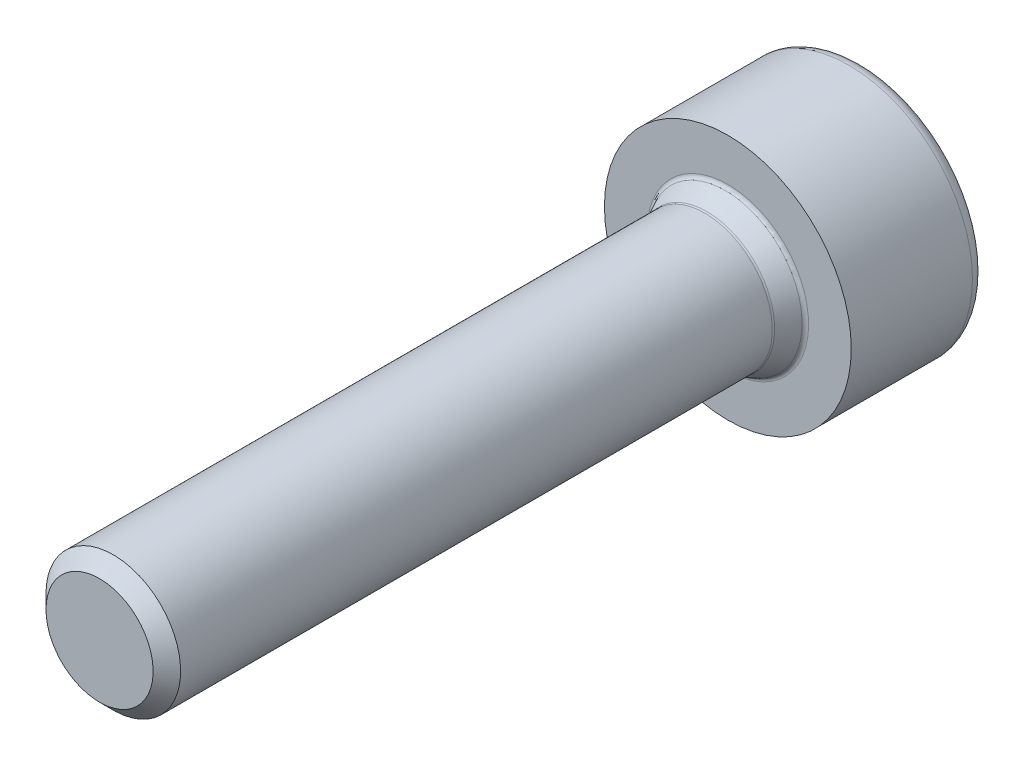
ISO-10303-21;
HEADER;
FILE_DESCRIPTION(('STEP AP214'),'2;1');
FILE_NAME('part.step','',(''),(''),'','','');
FILE_SCHEMA(('AUTOMOTIVE_DESIGN { 1 0 10303 214 1 1 1 1 }'));
ENDSEC;
DATA;
#1=APPLICATION_CONTEXT('core data for automotive mechanical design processes');
#2=APPLICATION_PROTOCOL_DEFINITION('international standard','automotive_design',2000,#1);
#3=PRODUCT_CONTEXT('',#1,'mechanical');
#4=PRODUCT('Part','Part','',(#3));
#5=PRODUCT_RELATED_PRODUCT_CATEGORY('part','',(#4));
#6=PRODUCT_DEFINITION_FORMATION('','',#4);
#7=PRODUCT_DEFINITION_CONTEXT('part definition',#1,'design');
#8=PRODUCT_DEFINITION('design','',#6,#7);
#9=PRODUCT_DEFINITION_SHAPE('','',#8);
#10=(LENGTH_UNIT() NAMED_UNIT(*) SI_UNIT(.MILLI.,.METRE.));
#11=(NAMED_UNIT(*) PLANE_ANGLE_UNIT() SI_UNIT($,.RADIAN.));
#12=(NAMED_UNIT(*) SI_UNIT($,.STERADIAN.) SOLID_ANGLE_UNIT());
#13=UNCERTAINTY_MEASURE_WITH_UNIT(LENGTH_MEASURE(1.E-05),#10,'distance_accuracy_value','');
#14=(GEOMETRIC_REPRESENTATION_CONTEXT(3) GLOBAL_UNCERTAINTY_ASSIGNED_CONTEXT((#13)) GLOBAL_UNIT_ASSIGNED_CONTEXT((#10,
#11,#12)) REPRESENTATION_CONTEXT('',''));
#15=CARTESIAN_POINT('',(0.,0.,0.));
#16=DIRECTION('',(0.,0.,1.));
#17=DIRECTION('',(1.,0.,0.));
#18=AXIS2_PLACEMENT_3D('',#15,#16,#17);
#19=CARTESIAN_POINT('',(-145.250000000003,415.751632486842,-409.507743681072));
#20=DIRECTION('',(0.,0.,1.));
#21=DIRECTION('',(1.,0.,0.));
#22=AXIS2_PLACEMENT_3D('',#19,#20,#21);
#23=PLANE('',#22);
#24=DIRECTION('',(-0.866025403784438,0.500000000000001,0.));
#25=VECTOR('',#24,1.);
#26=CARTESIAN_POINT('',(-144.000000000003,416.473320323329,-409.507743681072));
#27=LINE('',#26,#25);
#28=CARTESIAN_POINT('',(-144.625000000108,416.83416424139,-409.507743681423));
#29=VERTEX_POINT('',#28);
#30=CARTESIAN_POINT('',(-144.000000000003,416.473320323329,-409.507743681072));
#31=VERTEX_POINT('',#30);
#32=EDGE_CURVE('E162',#29,#31,#27,.F.);
#33=ORIENTED_EDGE('',*,*,#32,.T.);
#34=DIRECTION('',(0.,1.,0.));
#35=VECTOR('',#34,1.);
#36=CARTESIAN_POINT('',(-144.000000000003,415.029944650355,-409.507743681072));
#37=LINE('',#36,#35);
#38=CARTESIAN_POINT('',(-144.000000000213,415.751632486842,-409.507743681423));
#39=VERTEX_POINT('',#38);
#40=EDGE_CURVE('E158',#31,#39,#37,.F.);
#41=ORIENTED_EDGE('',*,*,#40,.T.);
#42=CARTESIAN_POINT('',(-145.250000000003,415.751632486842,-409.507743681774));
#43=DIRECTION('',(1.84168872111663E-13,0.,-1.));
#44=DIRECTION('',(-1.,0.,-1.84168872111663E-13));
#45=AXIS2_PLACEMENT_3D('',#42,#43,#44);
#46=CIRCLE('',#45,1.24999999957945);
#47=EDGE_CURVE('E159',#39,#29,#46,.F.);
#48=ORIENTED_EDGE('',*,*,#47,.T.);
#49=EDGE_LOOP('',(#33,#41,#48));
#50=FACE_BOUND('',#49,.T.);
#51=ADVANCED_FACE('F17',(#50),#23,.F.);
#52=CARTESIAN_POINT('',(-145.250000000003,415.751632486842,-409.507743681072));
#53=DIRECTION('',(0.,0.,1.));
#54=DIRECTION('',(1.,0.,0.));
#55=AXIS2_PLACEMENT_3D('',#52,#53,#54);
#56=PLANE('',#55);
#57=DIRECTION('',(-0.866025403784439,-0.499999999999999,0.));
#58=VECTOR('',#57,1.);
#59=CARTESIAN_POINT('',(-145.250000000003,417.195008159816,-409.507743681072));
#60=LINE('',#59,#58);
#61=CARTESIAN_POINT('',(-145.874999999898,416.83416424139,-409.507743681423));
#62=VERTEX_POINT('',#61);
#63=CARTESIAN_POINT('',(-145.250000000003,417.195008159816,-409.507743681072));
#64=VERTEX_POINT('',#63);
#65=EDGE_CURVE('E526',#62,#64,#60,.F.);
#66=ORIENTED_EDGE('',*,*,#65,.T.);
#67=DIRECTION('',(-0.866025403784438,0.500000000000001,0.));
#68=VECTOR('',#67,1.);
#69=CARTESIAN_POINT('',(-144.000000000003,416.473320323329,-409.507743681072));
#70=LINE('',#69,#68);
#71=EDGE_CURVE('E554',#64,#29,#70,.F.);
#72=ORIENTED_EDGE('',*,*,#71,.T.);
#73=CARTESIAN_POINT('',(-145.250000000003,415.751632486842,-409.507743681774));
#74=DIRECTION('',(1.84168872111663E-13,0.,-1.));
#75=DIRECTION('',(-1.,0.,-1.84168872111663E-13));
#76=AXIS2_PLACEMENT_3D('',#73,#74,#75);
#77=CIRCLE('',#76,1.24999999957946);
#78=EDGE_CURVE('E177',#62,#29,#77,.T.);
#79=ORIENTED_EDGE('',*,*,#78,.F.);
#80=EDGE_LOOP('',(#66,#72,#79));
#81=FACE_BOUND('',#80,.T.);
#82=ADVANCED_FACE('F752',(#81),#56,.F.);
#83=CARTESIAN_POINT('',(-144.000000000003,416.473320323329,-409.507743681072));
#84=DIRECTION('',(0.500000000000001,0.866025403784438,0.));
#85=DIRECTION('',(-0.866025403784438,0.500000000000001,0.));
#86=AXIS2_PLACEMENT_3D('',#83,#84,#85);
#87=PLANE('',#86);
#88=DIRECTION('',(-0.866025403784438,0.500000000000001,0.));
#89=VECTOR('',#88,1.);
#90=CARTESIAN_POINT('',(-144.000000000003,416.473320323329,-411.357743681072));
#91=LINE('',#90,#89);
#92=CARTESIAN_POINT('',(-144.000000000003,416.473320323329,-411.357743681072));
#93=VERTEX_POINT('',#92);
#94=CARTESIAN_POINT('',(-144.014636379167,416.48177064078,-411.357743681111));
#95=VERTEX_POINT('',#94);
#96=EDGE_CURVE('E426',#93,#95,#91,.T.);
#97=ORIENTED_EDGE('',*,*,#96,.F.);
#98=DIRECTION('',(0.,0.,-1.));
#99=VECTOR('',#98,1.);
#100=CARTESIAN_POINT('',(-144.000000000003,416.473320323329,-409.507743681072));
#101=LINE('',#100,#99);
#102=EDGE_CURVE('E167',#93,#31,#101,.F.);
#103=ORIENTED_EDGE('',*,*,#102,.T.);
#104=ORIENTED_EDGE('',*,*,#32,.F.);
#105=ORIENTED_EDGE('',*,*,#71,.F.);
#106=DIRECTION('',(0.,0.,1.));
#107=VECTOR('',#106,1.);
#108=CARTESIAN_POINT('',(-145.250000000003,417.195008159816,-409.507743681072));
#109=LINE('',#108,#107);
#110=CARTESIAN_POINT('',(-145.250000000003,417.195008159816,-411.357743681072));
#111=VERTEX_POINT('',#110);
#112=EDGE_CURVE('E516',#64,#111,#109,.F.);
#113=ORIENTED_EDGE('',*,*,#112,.T.);
#114=DIRECTION('',(-0.866025403784438,0.500000000000001,0.));
#115=VECTOR('',#114,1.);
#116=CARTESIAN_POINT('',(-144.000000000003,416.473320323329,-411.357743681072));
#117=LINE('',#116,#115);
#118=CARTESIAN_POINT('',(-145.235363620984,417.186557842449,-411.357743681194));
#119=VERTEX_POINT('',#118);
#120=EDGE_CURVE('E180',#119,#111,#117,.T.);
#121=ORIENTED_EDGE('',*,*,#120,.F.);
#122=CARTESIAN_POINT('',(-144.014636378931,416.48177064067,-411.357743681226));
#123=CARTESIAN_POINT('',(-144.056485828102,416.505932431397,-411.334028895885));
#124=CARTESIAN_POINT('',(-144.09902240462,416.530490935293,-411.311738212845));
#125=CARTESIAN_POINT('',(-144.185726749241,416.580549711994,-411.270951862306));
#126=CARTESIAN_POINT('',(-144.229902813105,416.60605477436,-411.252479912326));
#127=CARTESIAN_POINT('',(-144.31946765635,416.657765060719,-411.220650670305));
#128=CARTESIAN_POINT('',(-144.364851200154,416.683967261951,-411.207274243503));
#129=CARTESIAN_POINT('',(-144.456568934093,416.736920520329,-411.186723959837));
#130=CARTESIAN_POINT('',(-144.502899924673,416.763669730213,-411.179531920808));
#131=CARTESIAN_POINT('',(-144.561990829112,416.797785879797,-411.174774469158));
#132=CARTESIAN_POINT('',(-144.574586406246,416.805057939646,-411.174013782633));
#133=CARTESIAN_POINT('',(-144.59978740457,416.819607742812,-411.172998266346));
#134=CARTESIAN_POINT('',(-144.612392818697,416.826885482052,-411.17274320713));
#135=CARTESIAN_POINT('',(-144.65785508786,416.853133135391,-411.172744915652));
#136=CARTESIAN_POINT('',(-144.69072217761,416.872108958506,-411.174481617045));
#137=CARTESIAN_POINT('',(-144.75619989232,416.90991253472,-411.181325324928));
#138=CARTESIAN_POINT('',(-144.788810320065,416.928740173957,-411.186434707417));
#139=CARTESIAN_POINT('',(-144.886193237658,416.984964227643,-411.206499148701));
#140=CARTESIAN_POINT('',(-144.950257035471,417.021951478556,-411.226187273837));
#141=CARTESIAN_POINT('',(-145.051137795882,417.080195012735,-411.26545288316));
#142=CARTESIAN_POINT('',(-145.08887688856,417.101983688051,-411.282105843068));
#143=CARTESIAN_POINT('',(-145.163013606278,417.144786541983,-411.31808276048));
#144=CARTESIAN_POINT('',(-145.19941996507,417.165805763032,-411.337382565626));
#145=CARTESIAN_POINT('',(-145.235363621061,417.186557842494,-411.357743681238));
#146=B_SPLINE_CURVE_WITH_KNOTS('',3,(#122,#123,#124,#125,#126,#127,#128,#129,#130,#131,#132,
#133,#134,#135,#136,#137,#138,#139,#140,#141,#142,#143,#144,#145),.UNSPECIFIED.,.F.,.F.,(4,2,2,
2,2,2,2,2,2,2,2,4),(0.,0.161592976164731,0.324161275113117,0.48611293239924,0.64758680610695,
0.69127278648834,0.734938937454388,0.848735605527491,0.962612527221828,1.19125625179839,
1.33113310602939,1.46980937840557),.UNSPECIFIED.);
#147=EDGE_CURVE('E421',#95,#119,#146,.T.);
#148=ORIENTED_EDGE('',*,*,#147,.F.);
#149=EDGE_LOOP('',(#97,#103,#104,#105,#113,#121,#148));
#150=FACE_BOUND('',#149,.T.);
#151=ADVANCED_FACE('F412',(#150),#87,.F.);
#152=CARTESIAN_POINT('',(-144.000000000003,415.029944650355,-409.507743681072));
#153=DIRECTION('',(1.,0.,0.));
#154=DIRECTION('',(0.,0.,-1.));
#155=AXIS2_PLACEMENT_3D('',#152,#153,#154);
#156=PLANE('',#155);
#157=DIRECTION('',(0.,0.,1.));
#158=VECTOR('',#157,1.);
#159=CARTESIAN_POINT('',(-144.000000000003,415.029944650355,-409.507743681072));
#160=LINE('',#159,#158);
#161=CARTESIAN_POINT('',(-144.000000000003,415.029944650355,-411.357743681072));
#162=VERTEX_POINT('',#161);
#163=CARTESIAN_POINT('',(-144.000000000003,415.029944650355,-409.507743681072));
#164=VERTEX_POINT('',#163);
#165=EDGE_CURVE('E172',#162,#164,#160,.T.);
#166=ORIENTED_EDGE('',*,*,#165,.T.);
#167=DIRECTION('',(0.,1.,0.));
#168=VECTOR('',#167,1.);
#169=CARTESIAN_POINT('',(-144.000000000003,415.751632486842,-409.507743681072));
#170=LINE('',#169,#168);
#171=EDGE_CURVE('E146',#164,#39,#170,.T.);
#172=ORIENTED_EDGE('',*,*,#171,.T.);
#173=ORIENTED_EDGE('',*,*,#40,.F.);
#174=ORIENTED_EDGE('',*,*,#102,.F.);
#175=DIRECTION('',(0.,1.,0.));
#176=VECTOR('',#175,1.);
#177=CARTESIAN_POINT('',(-144.000000000003,415.029944650355,-411.357743681072));
#178=LINE('',#177,#176);
#179=CARTESIAN_POINT('',(-144.000000000003,416.456419688596,-411.357743681194));
#180=VERTEX_POINT('',#179);
#181=EDGE_CURVE('E420',#180,#93,#178,.T.);
#182=ORIENTED_EDGE('',*,*,#181,.F.);
#183=CARTESIAN_POINT('',(-143.99999999998,415.046845284996,-411.357743681226));
#184=CARTESIAN_POINT('',(-143.999999999994,415.095168866476,-411.334028895885));
#185=CARTESIAN_POINT('',(-144.000000000001,415.14428587428,-411.311738212844));
#186=CARTESIAN_POINT('',(-144.000000000005,415.244403427692,-411.270951862305));
#187=CARTESIAN_POINT('',(-144.000000000004,415.295413552422,-411.252479912325));
#188=CARTESIAN_POINT('',(-144.000000000002,415.398834125137,-411.220650670304));
#189=CARTESIAN_POINT('',(-144.000000000002,415.4512385276,-411.207274243503));
#190=CARTESIAN_POINT('',(-144.000000000004,415.557145044357,-411.186723959837));
#191=CARTESIAN_POINT('',(-144.000000000005,415.610643464123,-411.179531920809));
#192=CARTESIAN_POINT('',(-144.000000000002,415.678875763291,-411.174774469158));
#193=CARTESIAN_POINT('',(-144.000000000001,415.693419882989,-411.174013782632));
#194=CARTESIAN_POINT('',(-144.000000000005,415.722519489322,-411.172998266347));
#195=CARTESIAN_POINT('',(-144.000000000009,415.737074967801,-411.172743207132));
#196=CARTESIAN_POINT('',(-144.000000000016,415.78957027448,-411.172744915657));
#197=CARTESIAN_POINT('',(-144.000000000007,415.827521920709,-411.174481617047));
#198=CARTESIAN_POINT('',(-143.999999999999,415.903129073137,-411.181325324927));
#199=CARTESIAN_POINT('',(-144.000000000002,415.940784351611,-411.186434707417));
#200=CARTESIAN_POINT('',(-144.000000000005,416.053232458984,-411.206499148702));
#201=CARTESIAN_POINT('',(-144.000000000004,416.127206960809,-411.226187273837));
#202=CARTESIAN_POINT('',(-144.000000000003,416.243694029168,-411.26545288316));
#203=CARTESIAN_POINT('',(-144.000000000003,416.2872713798,-411.282105843068));
#204=CARTESIAN_POINT('',(-144.000000000003,416.372877087663,-411.31808276048));
#205=CARTESIAN_POINT('',(-144.000000000003,416.414915529761,-411.337382565626));
#206=CARTESIAN_POINT('',(-144.000000000003,416.456419688685,-411.357743681237));
#207=B_SPLINE_CURVE_WITH_KNOTS('',3,(#183,#184,#185,#186,#187,#188,#189,#190,#191,#192,#193,
#194,#195,#196,#197,#198,#199,#200,#201,#202,#203,#204,#205,#206),.UNSPECIFIED.,.F.,.F.,(4,2,2,
2,2,2,2,2,2,2,2,4),(0.,0.161592976167329,0.324161275117349,0.486112932401462,0.64758680610747,
0.691272786489091,0.73493893745551,0.848735605529345,0.962612527223534,1.19125625179938,
1.3311331060296,1.46980937840612),.UNSPECIFIED.);
#208=CARTESIAN_POINT('',(-144.000000000003,415.046845285256,-411.357743681111));
#209=VERTEX_POINT('',#208);
#210=EDGE_CURVE('E415',#209,#180,#207,.T.);
#211=ORIENTED_EDGE('',*,*,#210,.F.);
#212=DIRECTION('',(0.,1.,0.));
#213=VECTOR('',#212,1.);
#214=CARTESIAN_POINT('',(-144.000000000003,415.029944650355,-411.357743681072));
#215=LINE('',#214,#213);
#216=EDGE_CURVE('E166',#162,#209,#215,.T.);
#217=ORIENTED_EDGE('',*,*,#216,.F.);
#218=EDGE_LOOP('',(#166,#172,#173,#174,#182,#211,#217));
#219=FACE_BOUND('',#218,.T.);
#220=ADVANCED_FACE('F169',(#219),#156,.F.);
#221=CARTESIAN_POINT('',(-145.250000000003,415.751632486842,-409.507743681072));
#222=DIRECTION('',(0.,0.,1.));
#223=DIRECTION('',(1.,0.,0.));
#224=AXIS2_PLACEMENT_3D('',#221,#222,#223);
#225=PLANE('',#224);
#226=ORIENTED_EDGE('',*,*,#171,.F.);
#227=DIRECTION('',(0.866025403784439,0.499999999999999,0.));
#228=VECTOR('',#227,1.);
#229=CARTESIAN_POINT('',(-145.250000000003,414.308256813868,-409.507743681072));
#230=LINE('',#229,#228);
#231=CARTESIAN_POINT('',(-144.625000000108,414.669100732293,-409.507743681423));
#232=VERTEX_POINT('',#231);
#233=EDGE_CURVE('E148',#164,#232,#230,.F.);
#234=ORIENTED_EDGE('',*,*,#233,.T.);
#235=CARTESIAN_POINT('',(-145.250000000003,415.751632486842,-409.507743681774));
#236=DIRECTION('',(1.84168872111663E-13,0.,-1.));
#237=DIRECTION('',(-1.,0.,-1.84168872111663E-13));
#238=AXIS2_PLACEMENT_3D('',#235,#236,#237);
#239=CIRCLE('',#238,1.24999999957944);
#240=EDGE_CURVE('E142',#232,#39,#239,.F.);
#241=ORIENTED_EDGE('',*,*,#240,.T.);
#242=EDGE_LOOP('',(#226,#234,#241));
#243=FACE_BOUND('',#242,.T.);
#244=ADVANCED_FACE('F144',(#243),#225,.F.);
#245=CARTESIAN_POINT('',(-145.250000000003,415.751632486842,-409.507743681672));
#246=DIRECTION('',(1.84168872111663E-13,0.,-1.));
#247=DIRECTION('',(-1.,0.,-1.84168872111663E-13));
#248=AXIS2_PLACEMENT_3D('',#245,#246,#247);
#249=CONICAL_SURFACE('',#248,1.24999999940335,1.04719754971069);
#250=CARTESIAN_POINT('',(-145.250000000003,415.751632486842,-409.507743681774));
#251=DIRECTION('',(1.84168872111663E-13,0.,-1.));
#252=DIRECTION('',(-1.,0.,-1.84168872111663E-13));
#253=AXIS2_PLACEMENT_3D('',#250,#251,#252);
#254=CIRCLE('',#253,1.24999999957946);
#255=CARTESIAN_POINT('',(-146.499999999793,415.751632486842,-409.507743681423));
#256=VERTEX_POINT('',#255);
#257=EDGE_CURVE('E153',#256,#62,#254,.T.);
#258=ORIENTED_EDGE('',*,*,#257,.T.);
#259=ORIENTED_EDGE('',*,*,#78,.T.);
#260=ORIENTED_EDGE('',*,*,#47,.F.);
#261=ORIENTED_EDGE('',*,*,#240,.F.);
#262=CARTESIAN_POINT('',(-145.250000000003,415.751632486842,-409.507743681774));
#263=DIRECTION('',(1.84168872111663E-13,0.,-1.));
#264=DIRECTION('',(-1.,0.,-1.84168872111663E-13));
#265=AXIS2_PLACEMENT_3D('',#262,#263,#264);
#266=CIRCLE('',#265,1.24999999957944);
#267=CARTESIAN_POINT('',(-145.874999999898,414.669100732293,-409.507743681423));
#268=VERTEX_POINT('',#267);
#269=EDGE_CURVE('E380',#232,#268,#266,.T.);
#270=ORIENTED_EDGE('',*,*,#269,.T.);
#271=CARTESIAN_POINT('',(-145.250000000003,415.751632486842,-409.507743681774));
#272=DIRECTION('',(1.84168872111663E-13,0.,-1.));
#273=DIRECTION('',(-1.,0.,-1.84168872111663E-13));
#274=AXIS2_PLACEMENT_3D('',#271,#272,#273);
#275=CIRCLE('',#274,1.24999999957948);
#276=EDGE_CURVE('E789',#268,#256,#275,.T.);
#277=ORIENTED_EDGE('',*,*,#276,.T.);
#278=EDGE_LOOP('',(#258,#259,#260,#261,#270,#277));
#279=FACE_BOUND('',#278,.T.);
#280=CARTESIAN_POINT('',(-145.250000000003,415.751632486842,-408.786055843393));
#281=VERTEX_POINT('',#280);
#282=VERTEX_LOOP('',#281);
#283=FACE_BOUND('',#282,.T.);
#284=ADVANCED_FACE('F174',(#279,#283),#249,.F.);
#285=CARTESIAN_POINT('',(-145.250000000003,415.751632486842,-409.507743681072));
#286=DIRECTION('',(0.,0.,1.));
#287=DIRECTION('',(1.,0.,0.));
#288=AXIS2_PLACEMENT_3D('',#285,#286,#287);
#289=PLANE('',#288);
#290=DIRECTION('',(0.,1.,0.));
#291=VECTOR('',#290,1.);
#292=CARTESIAN_POINT('',(-146.500000000003,416.473320323329,-409.507743681072));
#293=LINE('',#292,#291);
#294=CARTESIAN_POINT('',(-146.500000000003,416.473320323329,-409.507743681072));
#295=VERTEX_POINT('',#294);
#296=EDGE_CURVE('E511',#256,#295,#293,.T.);
#297=ORIENTED_EDGE('',*,*,#296,.T.);
#298=DIRECTION('',(-0.866025403784439,-0.499999999999999,0.));
#299=VECTOR('',#298,1.);
#300=CARTESIAN_POINT('',(-145.250000000003,417.195008159816,-409.507743681072));
#301=LINE('',#300,#299);
#302=EDGE_CURVE('E521',#295,#62,#301,.F.);
#303=ORIENTED_EDGE('',*,*,#302,.T.);
#304=ORIENTED_EDGE('',*,*,#257,.F.);
#305=EDGE_LOOP('',(#297,#303,#304));
#306=FACE_BOUND('',#305,.T.);
#307=ADVANCED_FACE('F400',(#306),#289,.F.);
#308=CARTESIAN_POINT('',(-145.250000000003,417.195008159816,-409.507743681072));
#309=DIRECTION('',(-0.499999999999999,0.866025403784439,0.));
#310=DIRECTION('',(-0.866025403784439,-0.499999999999999,0.));
#311=AXIS2_PLACEMENT_3D('',#308,#309,#310);
#312=PLANE('',#311);
#313=ORIENTED_EDGE('',*,*,#112,.F.);
#314=ORIENTED_EDGE('',*,*,#65,.F.);
#315=ORIENTED_EDGE('',*,*,#302,.F.);
#316=DIRECTION('',(0.,0.,1.));
#317=VECTOR('',#316,1.);
#318=CARTESIAN_POINT('',(-146.500000000003,416.473320323329,-409.507743681072));
#319=LINE('',#318,#317);
#320=CARTESIAN_POINT('',(-146.500000000003,416.473320323329,-411.357743681072));
#321=VERTEX_POINT('',#320);
#322=EDGE_CURVE('E507',#295,#321,#319,.F.);
#323=ORIENTED_EDGE('',*,*,#322,.T.);
#324=DIRECTION('',(-0.866025403784439,-0.499999999999999,0.));
#325=VECTOR('',#324,1.);
#326=CARTESIAN_POINT('',(-145.250000000003,417.195008159816,-411.357743681072));
#327=LINE('',#326,#325);
#328=CARTESIAN_POINT('',(-146.485363620984,416.481770640696,-411.357743681194));
#329=VERTEX_POINT('',#328);
#330=EDGE_CURVE('E519',#329,#321,#327,.T.);
#331=ORIENTED_EDGE('',*,*,#330,.F.);
#332=CARTESIAN_POINT('',(-145.264636378954,417.186557842516,-411.357743681226));
#333=CARTESIAN_POINT('',(-145.306485828111,417.162396051763,-411.334028895885));
#334=CARTESIAN_POINT('',(-145.349022404623,417.137837547855,-411.311738212844));
#335=CARTESIAN_POINT('',(-145.435726749241,417.087778771145,-411.270951862305));
#336=CARTESIAN_POINT('',(-145.479902813107,417.062273708782,-411.252479912325));
#337=CARTESIAN_POINT('',(-145.569467656353,417.010563422426,-411.220650670304));
#338=CARTESIAN_POINT('',(-145.614851200157,416.984361221194,-411.207274243503));
#339=CARTESIAN_POINT('',(-145.706568934093,416.931407962814,-411.186723959837));
#340=CARTESIAN_POINT('',(-145.752899924672,416.90465875293,-411.17953192081));
#341=CARTESIAN_POINT('',(-145.811990829112,416.870542603348,-411.174774469158));
#342=CARTESIAN_POINT('',(-145.824586406247,416.8632705435,-411.174013782632));
#343=CARTESIAN_POINT('',(-145.84978740457,416.848720740331,-411.172998266347));
#344=CARTESIAN_POINT('',(-145.862392818695,416.841443001088,-411.172743207133));
#345=CARTESIAN_POINT('',(-145.907855087854,416.815195347743,-411.172744915658));
#346=CARTESIAN_POINT('',(-145.940722177609,416.796219524636,-411.174481617047));
#347=CARTESIAN_POINT('',(-146.006199892323,416.758415948428,-411.181325324927));
#348=CARTESIAN_POINT('',(-146.038810320067,416.739588309189,-411.186434707417));
#349=CARTESIAN_POINT('',(-146.136193237657,416.683364255499,-411.206499148702));
#350=CARTESIAN_POINT('',(-146.200257035472,416.646377004588,-411.226187273837));
#351=CARTESIAN_POINT('',(-146.301137795883,416.58813347041,-411.26545288316));
#352=CARTESIAN_POINT('',(-146.33887688856,416.566344795094,-411.282105843068));
#353=CARTESIAN_POINT('',(-146.413013606278,416.523541941162,-411.31808276048));
#354=CARTESIAN_POINT('',(-146.44941996507,416.502522720113,-411.337382565626));
#355=CARTESIAN_POINT('',(-146.485363621061,416.481770640651,-411.357743681238));
#356=B_SPLINE_CURVE_WITH_KNOTS('',3,(#332,#333,#334,#335,#336,#337,#338,#339,#340,#341,#342,
#343,#344,#345,#346,#347,#348,#349,#350,#351,#352,#353,#354,#355),.UNSPECIFIED.,.F.,.F.,(4,2,2,
2,2,2,2,2,2,2,2,4),(0.,0.161592976167028,0.32416127511685,0.486112932400692,0.647586806106609,
0.691272786488301,0.734938937454753,0.848735605528526,0.962612527222728,1.19125625179851,
1.33113310602869,1.46980937840512),.UNSPECIFIED.);
#357=CARTESIAN_POINT('',(-145.264636379168,417.186557842365,-411.357743681112));
#358=VERTEX_POINT('',#357);
#359=EDGE_CURVE('E381',#358,#329,#356,.T.);
#360=ORIENTED_EDGE('',*,*,#359,.F.);
#361=DIRECTION('',(-0.866025403784439,-0.499999999999999,0.));
#362=VECTOR('',#361,1.);
#363=CARTESIAN_POINT('',(-145.250000000003,417.195008159816,-411.357743681072));
#364=LINE('',#363,#362);
#365=EDGE_CURVE('E379',#111,#358,#364,.T.);
#366=ORIENTED_EDGE('',*,*,#365,.F.);
#367=EDGE_LOOP('',(#313,#314,#315,#323,#331,#360,#366));
#368=FACE_BOUND('',#367,.T.);
#369=ADVANCED_FACE('F394',(#368),#312,.F.);
#370=CARTESIAN_POINT('',(-145.250000000003,414.308256813868,-409.507743681072));
#371=DIRECTION('',(0.499999999999999,-0.866025403784439,0.));
#372=DIRECTION('',(0.866025403784439,0.499999999999999,0.));
#373=AXIS2_PLACEMENT_3D('',#370,#371,#372);
#374=PLANE('',#373);
#375=DIRECTION('',(0.,0.,1.));
#376=VECTOR('',#375,1.);
#377=CARTESIAN_POINT('',(-145.250000000003,414.308256813868,-409.507743681072));
#378=LINE('',#377,#376);
#379=CARTESIAN_POINT('',(-145.250000000003,414.308256813868,-411.357743681072));
#380=VERTEX_POINT('',#379);
#381=CARTESIAN_POINT('',(-145.250000000003,414.308256813868,-409.507743681072));
#382=VERTEX_POINT('',#381);
#383=EDGE_CURVE('E798',#380,#382,#378,.T.);
#384=ORIENTED_EDGE('',*,*,#383,.T.);
#385=DIRECTION('',(0.866025403784722,0.49999999999951,0.));
#386=VECTOR('',#385,1.);
#387=CARTESIAN_POINT('',(-145.250000000003,414.308256813868,-409.507743681072));
#388=LINE('',#387,#386);
#389=EDGE_CURVE('E819',#382,#232,#388,.T.);
#390=ORIENTED_EDGE('',*,*,#389,.T.);
#391=ORIENTED_EDGE('',*,*,#233,.F.);
#392=ORIENTED_EDGE('',*,*,#165,.F.);
#393=DIRECTION('',(0.866025403784439,0.499999999999999,0.));
#394=VECTOR('',#393,1.);
#395=CARTESIAN_POINT('',(-145.250000000003,414.308256813868,-411.357743681072));
#396=LINE('',#395,#394);
#397=CARTESIAN_POINT('',(-144.014636379023,415.021494332988,-411.357743681193));
#398=VERTEX_POINT('',#397);
#399=EDGE_CURVE('E378',#398,#162,#396,.T.);
#400=ORIENTED_EDGE('',*,*,#399,.F.);
#401=CARTESIAN_POINT('',(-145.235363621052,414.316707131168,-411.357743681226));
#402=CARTESIAN_POINT('',(-145.193514171896,414.340868921921,-411.334028895885));
#403=CARTESIAN_POINT('',(-145.150977595383,414.365427425828,-411.311738212844));
#404=CARTESIAN_POINT('',(-145.064273250766,414.415486202539,-411.270951862305));
#405=CARTESIAN_POINT('',(-145.020097186899,414.440991264902,-411.252479912325));
#406=CARTESIAN_POINT('',(-144.930532343653,414.492701551258,-411.220650670304));
#407=CARTESIAN_POINT('',(-144.885148799849,414.51890375249,-411.207274243503));
#408=CARTESIAN_POINT('',(-144.793431065913,414.57185701087,-411.186723959837));
#409=CARTESIAN_POINT('',(-144.747100075334,414.598606220754,-411.179531920809));
#410=CARTESIAN_POINT('',(-144.688009170894,414.632722370336,-411.174774469158));
#411=CARTESIAN_POINT('',(-144.675413593759,414.639994430184,-411.174013782632));
#412=CARTESIAN_POINT('',(-144.650212595437,414.654544233353,-411.172998266347));
#413=CARTESIAN_POINT('',(-144.637607181312,414.661821972596,-411.172743207132));
#414=CARTESIAN_POINT('',(-144.592144912152,414.688069625941,-411.172744915657));
#415=CARTESIAN_POINT('',(-144.559277822397,414.707045449048,-411.174481617047));
#416=CARTESIAN_POINT('',(-144.493800107683,414.744849025256,-411.181325324927));
#417=CARTESIAN_POINT('',(-144.461189679939,414.763676664495,-411.186434707417));
#418=CARTESIAN_POINT('',(-144.363806762349,414.819900718184,-411.206499148702));
#419=CARTESIAN_POINT('',(-144.299742964535,414.856887969096,-411.226187273837));
#420=CARTESIAN_POINT('',(-144.198862204123,414.915131503274,-411.26545288316));
#421=CARTESIAN_POINT('',(-144.161123111447,414.93692017859,-411.282105843068));
#422=CARTESIAN_POINT('',(-144.086986393728,414.979723032522,-411.31808276048));
#423=CARTESIAN_POINT('',(-144.050580034936,415.000742253571,-411.337382565625));
#424=CARTESIAN_POINT('',(-144.014636378946,415.021494333033,-411.357743681237));
#425=B_SPLINE_CURVE_WITH_KNOTS('',3,(#401,#402,#403,#404,#405,#406,#407,#408,#409,#410,#411,
#412,#413,#414,#415,#416,#417,#418,#419,#420,#421,#422,#423,#424),.UNSPECIFIED.,.F.,.F.,(4,2,2,
2,2,2,2,2,2,2,2,4),(0.,0.161592976167323,0.324161275117457,0.486112932401594,0.647586806107648,
0.691272786489062,0.734938937455222,0.848735605528959,0.962612527223252,1.19125625179907,
1.33113310602909,1.46980937840536),.UNSPECIFIED.);
#426=CARTESIAN_POINT('',(-145.235363620838,414.316707131319,-411.357743681111));
#427=VERTEX_POINT('',#426);
#428=EDGE_CURVE('E370',#427,#398,#425,.T.);
#429=ORIENTED_EDGE('',*,*,#428,.F.);
#430=DIRECTION('',(0.866025403784439,0.499999999999999,0.));
#431=VECTOR('',#430,1.);
#432=CARTESIAN_POINT('',(-145.250000000003,414.308256813868,-411.357743681072));
#433=LINE('',#432,#431);
#434=EDGE_CURVE('E498',#380,#427,#433,.T.);
#435=ORIENTED_EDGE('',*,*,#434,.F.);
#436=EDGE_LOOP('',(#384,#390,#391,#392,#400,#429,#435));
#437=FACE_BOUND('',#436,.T.);
#438=ADVANCED_FACE('F389',(#437),#374,.F.);
#439=CARTESIAN_POINT('',(-145.250000000003,415.751632486842,-409.507743681072));
#440=DIRECTION('',(0.,0.,1.));
#441=DIRECTION('',(1.,0.,0.));
#442=AXIS2_PLACEMENT_3D('',#439,#440,#441);
#443=PLANE('',#442);
#444=ORIENTED_EDGE('',*,*,#389,.F.);
#445=DIRECTION('',(0.866025403784438,-0.500000000000001,0.));
#446=VECTOR('',#445,1.);
#447=CARTESIAN_POINT('',(-146.500000000003,415.029944650355,-409.507743681072));
#448=LINE('',#447,#446);
#449=EDGE_CURVE('E812',#382,#268,#448,.F.);
#450=ORIENTED_EDGE('',*,*,#449,.T.);
#451=ORIENTED_EDGE('',*,*,#269,.F.);
#452=EDGE_LOOP('',(#444,#450,#451));
#453=FACE_BOUND('',#452,.T.);
#454=ADVANCED_FACE('F393',(#453),#443,.F.);
#455=CARTESIAN_POINT('',(-145.250000000003,415.751632486842,-409.507743681072));
#456=DIRECTION('',(0.,0.,1.));
#457=DIRECTION('',(1.,0.,0.));
#458=AXIS2_PLACEMENT_3D('',#455,#456,#457);
#459=PLANE('',#458);
#460=DIRECTION('',(0.866025403784438,-0.500000000000001,0.));
#461=VECTOR('',#460,1.);
#462=CARTESIAN_POINT('',(-146.500000000003,415.029944650355,-409.507743681072));
#463=LINE('',#462,#461);
#464=CARTESIAN_POINT('',(-146.500000000003,415.029944650355,-409.507743681072));
#465=VERTEX_POINT('',#464);
#466=EDGE_CURVE('E337',#268,#465,#463,.F.);
#467=ORIENTED_EDGE('',*,*,#466,.T.);
#468=DIRECTION('',(0.,1.,0.));
#469=VECTOR('',#468,1.);
#470=CARTESIAN_POINT('',(-146.500000000003,416.473320323329,-409.507743681072));
#471=LINE('',#470,#469);
#472=EDGE_CURVE('E530',#465,#256,#471,.T.);
#473=ORIENTED_EDGE('',*,*,#472,.T.);
#474=ORIENTED_EDGE('',*,*,#276,.F.);
#475=EDGE_LOOP('',(#467,#473,#474));
#476=FACE_BOUND('',#475,.T.);
#477=ADVANCED_FACE('F700',(#476),#459,.F.);
#478=CARTESIAN_POINT('',(-146.500000000003,416.473320323329,-409.507743681072));
#479=DIRECTION('',(-1.,0.,0.));
#480=DIRECTION('',(0.,0.,1.));
#481=AXIS2_PLACEMENT_3D('',#478,#479,#480);
#482=PLANE('',#481);
#483=ORIENTED_EDGE('',*,*,#322,.F.);
#484=ORIENTED_EDGE('',*,*,#296,.F.);
#485=ORIENTED_EDGE('',*,*,#472,.F.);
#486=DIRECTION('',(0.,0.,1.));
#487=VECTOR('',#486,1.);
#488=CARTESIAN_POINT('',(-146.500000000003,415.029944650355,-409.507743681072));
#489=LINE('',#488,#487);
#490=CARTESIAN_POINT('',(-146.500000000003,415.029944650355,-411.357743681072));
#491=VERTEX_POINT('',#490);
#492=EDGE_CURVE('E331',#465,#491,#489,.F.);
#493=ORIENTED_EDGE('',*,*,#492,.T.);
#494=DIRECTION('',(0.,1.,0.));
#495=VECTOR('',#494,1.);
#496=CARTESIAN_POINT('',(-146.500000000003,416.473320323329,-411.357743681072));
#497=LINE('',#496,#495);
#498=CARTESIAN_POINT('',(-146.500000000003,415.046845285089,-411.357743681194));
#499=VERTEX_POINT('',#498);
#500=EDGE_CURVE('E804',#499,#491,#497,.F.);
#501=ORIENTED_EDGE('',*,*,#500,.F.);
#502=CARTESIAN_POINT('',(-146.500000000027,416.456419688688,-411.357743681227));
#503=CARTESIAN_POINT('',(-146.500000000012,416.408096107208,-411.334028895886));
#504=CARTESIAN_POINT('',(-146.500000000005,416.358979099404,-411.311738212845));
#505=CARTESIAN_POINT('',(-146.500000000001,416.258861545992,-411.270951862306));
#506=CARTESIAN_POINT('',(-146.500000000002,416.207851421262,-411.252479912326));
#507=CARTESIAN_POINT('',(-146.500000000004,416.104430848547,-411.220650670304));
#508=CARTESIAN_POINT('',(-146.500000000004,416.052026446084,-411.207274243503));
#509=CARTESIAN_POINT('',(-146.500000000002,415.946119929327,-411.186723959837));
#510=CARTESIAN_POINT('',(-146.500000000001,415.892621509561,-411.17953192081));
#511=CARTESIAN_POINT('',(-146.500000000004,415.824389210393,-411.174774469158));
#512=CARTESIAN_POINT('',(-146.500000000005,415.809845090695,-411.174013782632));
#513=CARTESIAN_POINT('',(-146.500000000001,415.780745484362,-411.172998266347));
#514=CARTESIAN_POINT('',(-146.499999999997,415.766190005883,-411.172743207133));
#515=CARTESIAN_POINT('',(-146.49999999999,415.713694699205,-411.172744915658));
#516=CARTESIAN_POINT('',(-146.499999999999,415.675743052975,-411.174481617047));
#517=CARTESIAN_POINT('',(-146.500000000007,415.600135900547,-411.181325324927));
#518=CARTESIAN_POINT('',(-146.500000000004,415.562480622073,-411.186434707418));
#519=CARTESIAN_POINT('',(-146.500000000001,415.4500325147,-411.206499148702));
#520=CARTESIAN_POINT('',(-146.500000000002,415.376058012875,-411.226187273837));
#521=CARTESIAN_POINT('',(-146.500000000003,415.259570944516,-411.26545288316));
#522=CARTESIAN_POINT('',(-146.500000000003,415.215993593884,-411.282105843068));
#523=CARTESIAN_POINT('',(-146.500000000003,415.130387886021,-411.31808276048));
#524=CARTESIAN_POINT('',(-146.500000000003,415.088349443923,-411.337382565626));
#525=CARTESIAN_POINT('',(-146.500000000003,415.046845285,-411.357743681238));
#526=B_SPLINE_CURVE_WITH_KNOTS('',3,(#502,#503,#504,#505,#506,#507,#508,#509,#510,#511,#512,
#513,#514,#515,#516,#517,#518,#519,#520,#521,#522,#523,#524,#525),.UNSPECIFIED.,.F.,.F.,(4,2,2,
2,2,2,2,2,2,2,2,4),(0.,0.161592976167261,0.324161275117176,0.486112932401195,0.647586806107196,
0.691272786488875,0.734938937455183,0.848735605528963,0.962612527223206,1.19125625179895,
1.33113310602915,1.46980937840559),.UNSPECIFIED.);
#527=CARTESIAN_POINT('',(-146.500000000003,416.456419688427,-411.357743681112));
#528=VERTEX_POINT('',#527);
#529=EDGE_CURVE('E347',#528,#499,#526,.T.);
#530=ORIENTED_EDGE('',*,*,#529,.F.);
#531=DIRECTION('',(0.,1.,0.));
#532=VECTOR('',#531,1.);
#533=CARTESIAN_POINT('',(-146.500000000003,416.473320323329,-411.357743681072));
#534=LINE('',#533,#532);
#535=EDGE_CURVE('E510',#321,#528,#534,.F.);
#536=ORIENTED_EDGE('',*,*,#535,.F.);
#537=EDGE_LOOP('',(#483,#484,#485,#493,#501,#530,#536));
#538=FACE_BOUND('',#537,.T.);
#539=ADVANCED_FACE('F693',(#538),#482,.F.);
#540=CARTESIAN_POINT('',(-146.500000000003,415.029944650355,-409.507743681072));
#541=DIRECTION('',(-0.500000000000001,-0.866025403784438,0.));
#542=DIRECTION('',(0.866025403784438,-0.500000000000001,0.));
#543=AXIS2_PLACEMENT_3D('',#540,#541,#542);
#544=PLANE('',#543);
#545=ORIENTED_EDGE('',*,*,#492,.F.);
#546=ORIENTED_EDGE('',*,*,#466,.F.);
#547=ORIENTED_EDGE('',*,*,#449,.F.);
#548=ORIENTED_EDGE('',*,*,#383,.F.);
#549=DIRECTION('',(0.866025403784438,-0.500000000000001,0.));
#550=VECTOR('',#549,1.);
#551=CARTESIAN_POINT('',(-146.500000000003,415.029944650355,-411.357743681072));
#552=LINE('',#551,#550);
#553=CARTESIAN_POINT('',(-145.264636379094,414.316707131276,-411.357743681153));
#554=VERTEX_POINT('',#553);
#555=EDGE_CURVE('E796',#554,#380,#552,.T.);
#556=ORIENTED_EDGE('',*,*,#555,.F.);
#557=CARTESIAN_POINT('',(-145.264636378957,414.316707131172,-411.357743681225));
#558=CARTESIAN_POINT('',(-145.306485828113,414.340868921923,-411.334028895884));
#559=CARTESIAN_POINT('',(-145.349022404625,414.36542742583,-411.311738212844));
#560=CARTESIAN_POINT('',(-145.435726749241,414.415486202538,-411.270951862305));
#561=CARTESIAN_POINT('',(-145.479902813107,414.440991264901,-411.252479912326));
#562=CARTESIAN_POINT('',(-145.569467656352,414.492701551258,-411.220650670305));
#563=CARTESIAN_POINT('',(-145.614851200156,414.51890375249,-411.207274243503));
#564=CARTESIAN_POINT('',(-145.706568934093,414.571857010869,-411.186723959837));
#565=CARTESIAN_POINT('',(-145.752899924673,414.598606220752,-411.179531920809));
#566=CARTESIAN_POINT('',(-145.811990829112,414.632722370336,-411.174774469158));
#567=CARTESIAN_POINT('',(-145.824586406246,414.639994430185,-411.174013782633));
#568=CARTESIAN_POINT('',(-145.84978740457,414.654544233351,-411.172998266347));
#569=CARTESIAN_POINT('',(-145.862392818697,414.661821972591,-411.17274320713));
#570=CARTESIAN_POINT('',(-145.90785508786,414.68806962593,-411.172744915652));
#571=CARTESIAN_POINT('',(-145.94072217761,414.707045449044,-411.174481617046));
#572=CARTESIAN_POINT('',(-146.00619989232,414.744849025258,-411.181325324928));
#573=CARTESIAN_POINT('',(-146.038810320065,414.763676664496,-411.186434707418));
#574=CARTESIAN_POINT('',(-146.136193237658,414.819900718182,-411.206499148701));
#575=CARTESIAN_POINT('',(-146.200257035471,414.856887969095,-411.226187273837));
#576=CARTESIAN_POINT('',(-146.301137795882,414.915131503274,-411.26545288316));
#577=CARTESIAN_POINT('',(-146.338876888559,414.93692017859,-411.282105843068));
#578=CARTESIAN_POINT('',(-146.413013606276,414.979723032521,-411.318082760479));
#579=CARTESIAN_POINT('',(-146.449419965068,415.00074225357,-411.337382565625));
#580=CARTESIAN_POINT('',(-146.485363621058,415.021494333031,-411.357743681236));
#581=B_SPLINE_CURVE_WITH_KNOTS('',3,(#557,#558,#559,#560,#561,#562,#563,#564,#565,#566,#567,
#568,#569,#570,#571,#572,#573,#574,#575,#576,#577,#578,#579,#580),.UNSPECIFIED.,.F.,.F.,(4,2,2,
2,2,2,2,2,2,2,2,4),(0.,0.161592976163727,0.324161275111037,0.486112932396147,0.647586806102767,
0.691272786484109,0.734938937450082,0.848735605523289,0.962612527217721,1.19125625179461,
1.3311331060235,1.46980937839761),.UNSPECIFIED.);
#582=CARTESIAN_POINT('',(-146.485363620982,415.021494332987,-411.357743681193));
#583=VERTEX_POINT('',#582);
#584=EDGE_CURVE('E324',#554,#583,#581,.T.);
#585=ORIENTED_EDGE('',*,*,#584,.T.);
#586=DIRECTION('',(0.866025403784633,-0.499999999999664,0.));
#587=VECTOR('',#586,1.);
#588=CARTESIAN_POINT('',(-146.500000000003,415.029944650355,-411.357743681072));
#589=LINE('',#588,#587);
#590=EDGE_CURVE('E315',#491,#583,#589,.T.);
#591=ORIENTED_EDGE('',*,*,#590,.F.);
#592=EDGE_LOOP('',(#545,#546,#547,#548,#556,#585,#591));
#593=FACE_BOUND('',#592,.T.);
#594=ADVANCED_FACE('F354',(#593),#544,.F.);
#595=CARTESIAN_POINT('',(-145.250000000003,415.751632486842,-411.357743681094));
#596=DIRECTION('',(2.1067748488078E-13,0.,-1.));
#597=DIRECTION('',(-1.,0.,-2.1067748488078E-13));
#598=AXIS2_PLACEMENT_3D('',#595,#596,#597);
#599=CONICAL_SURFACE('',#598,1.43499999981486,0.785398162432326);
#600=CARTESIAN_POINT('',(-145.250000000003,415.751632486842,-411.357743681151));
#601=DIRECTION('',(2.1067748488078E-13,0.,-1.));
#602=DIRECTION('',(-1.,0.,-2.1067748488078E-13));
#603=AXIS2_PLACEMENT_3D('',#600,#601,#602);
#604=CIRCLE('',#603,1.43499999987168);
#605=EDGE_CURVE('E323',#583,#554,#604,.F.);
#606=ORIENTED_EDGE('',*,*,#605,.F.);
#607=ORIENTED_EDGE('',*,*,#584,.F.);
#608=EDGE_LOOP('',(#606,#607));
#609=FACE_BOUND('',#608,.T.);
#610=ADVANCED_FACE('F356',(#609),#599,.F.);
#611=CARTESIAN_POINT('',(-145.250000000003,415.751632486842,-411.357743681094));
#612=DIRECTION('',(2.1067748488078E-13,0.,-1.));
#613=DIRECTION('',(-1.,0.,-2.1067748488078E-13));
#614=AXIS2_PLACEMENT_3D('',#611,#612,#613);
#615=CONICAL_SURFACE('',#614,1.43499999981486,0.785398162432326);
#616=ORIENTED_EDGE('',*,*,#428,.T.);
#617=CARTESIAN_POINT('',(-145.250000000003,415.751632486842,-411.357743681151));
#618=DIRECTION('',(2.1067748488078E-13,0.,-1.));
#619=DIRECTION('',(-1.,0.,-2.1067748488078E-13));
#620=AXIS2_PLACEMENT_3D('',#617,#618,#619);
#621=CIRCLE('',#620,1.43499999987173);
#622=EDGE_CURVE('E329',#427,#398,#621,.F.);
#623=ORIENTED_EDGE('',*,*,#622,.F.);
#624=EDGE_LOOP('',(#616,#623));
#625=FACE_BOUND('',#624,.T.);
#626=ADVANCED_FACE('F360',(#625),#615,.F.);
#627=CARTESIAN_POINT('',(-145.250000000003,415.751632486842,-411.357743681094));
#628=DIRECTION('',(2.1067748488078E-13,0.,-1.));
#629=DIRECTION('',(-1.,0.,-2.1067748488078E-13));
#630=AXIS2_PLACEMENT_3D('',#627,#628,#629);
#631=CONICAL_SURFACE('',#630,1.43499999981486,0.785398162432326);
#632=ORIENTED_EDGE('',*,*,#210,.T.);
#633=CARTESIAN_POINT('',(-145.250000000003,415.751632486842,-411.357743681151));
#634=DIRECTION('',(2.1067748488078E-13,0.,-1.));
#635=DIRECTION('',(-1.,0.,-2.1067748488078E-13));
#636=AXIS2_PLACEMENT_3D('',#633,#634,#635);
#637=CIRCLE('',#636,1.43499999987175);
#638=EDGE_CURVE('E489',#209,#180,#637,.F.);
#639=ORIENTED_EDGE('',*,*,#638,.F.);
#640=EDGE_LOOP('',(#632,#639));
#641=FACE_BOUND('',#640,.T.);
#642=ADVANCED_FACE('F365',(#641),#631,.F.);
#643=CARTESIAN_POINT('',(-145.250000000003,415.751632486842,-411.357743681094));
#644=DIRECTION('',(2.1067748488078E-13,0.,-1.));
#645=DIRECTION('',(-1.,0.,-2.1067748488078E-13));
#646=AXIS2_PLACEMENT_3D('',#643,#644,#645);
#647=CONICAL_SURFACE('',#646,1.43499999981486,0.785398162432326);
#648=CARTESIAN_POINT('',(-145.250000000003,415.751632486842,-411.357743681151));
#649=DIRECTION('',(2.1067748488078E-13,0.,-1.));
#650=DIRECTION('',(-1.,0.,-2.1067748488078E-13));
#651=AXIS2_PLACEMENT_3D('',#648,#649,#650);
#652=CIRCLE('',#651,1.43499999987178);
#653=EDGE_CURVE('E486',#95,#119,#652,.F.);
#654=ORIENTED_EDGE('',*,*,#653,.F.);
#655=ORIENTED_EDGE('',*,*,#147,.T.);
#656=EDGE_LOOP('',(#654,#655));
#657=FACE_BOUND('',#656,.T.);
#658=ADVANCED_FACE('F427',(#657),#647,.F.);
#659=CARTESIAN_POINT('',(-145.250000000003,415.751632486842,-411.357743681094));
#660=DIRECTION('',(2.1067748488078E-13,0.,-1.));
#661=DIRECTION('',(-1.,0.,-2.1067748488078E-13));
#662=AXIS2_PLACEMENT_3D('',#659,#660,#661);
#663=CONICAL_SURFACE('',#662,1.43499999981486,0.785398162432326);
#664=CARTESIAN_POINT('',(-145.250000000003,415.751632486842,-411.357743681151));
#665=DIRECTION('',(2.1067748488078E-13,0.,-1.));
#666=DIRECTION('',(-1.,0.,-2.1067748488078E-13));
#667=AXIS2_PLACEMENT_3D('',#664,#665,#666);
#668=CIRCLE('',#667,1.43499999987172);
#669=EDGE_CURVE('E483',#358,#329,#668,.F.);
#670=ORIENTED_EDGE('',*,*,#669,.F.);
#671=ORIENTED_EDGE('',*,*,#359,.T.);
#672=EDGE_LOOP('',(#670,#671));
#673=FACE_BOUND('',#672,.T.);
#674=ADVANCED_FACE('F430',(#673),#663,.F.);
#675=CARTESIAN_POINT('',(-145.250000000003,415.751632486842,-411.357743681094));
#676=DIRECTION('',(2.1067748488078E-13,0.,-1.));
#677=DIRECTION('',(-1.,0.,-2.1067748488078E-13));
#678=AXIS2_PLACEMENT_3D('',#675,#676,#677);
#679=CONICAL_SURFACE('',#678,1.43499999981486,0.785398162432326);
#680=CARTESIAN_POINT('',(-145.250000000003,415.751632486842,-411.357743681151));
#681=DIRECTION('',(2.1067748488078E-13,0.,-1.));
#682=DIRECTION('',(-1.,0.,-2.1067748488078E-13));
#683=AXIS2_PLACEMENT_3D('',#680,#681,#682);
#684=CIRCLE('',#683,1.4349999998717);
#685=EDGE_CURVE('E480',#528,#499,#684,.F.);
#686=ORIENTED_EDGE('',*,*,#685,.F.);
#687=ORIENTED_EDGE('',*,*,#529,.T.);
#688=EDGE_LOOP('',(#686,#687));
#689=FACE_BOUND('',#688,.T.);
#690=ADVANCED_FACE('F434',(#689),#679,.F.);
#691=CARTESIAN_POINT('',(-143.567745653152,414.780382486842,-411.357743681072));
#692=DIRECTION('',(0.,0.,-1.));
#693=DIRECTION('',(-1.,0.,0.));
#694=AXIS2_PLACEMENT_3D('',#691,#692,#693);
#695=PLANE('',#694);
#696=ORIENTED_EDGE('',*,*,#535,.T.);
#697=ORIENTED_EDGE('',*,*,#685,.T.);
#698=ORIENTED_EDGE('',*,*,#500,.T.);
#699=ORIENTED_EDGE('',*,*,#590,.T.);
#700=ORIENTED_EDGE('',*,*,#605,.T.);
#701=ORIENTED_EDGE('',*,*,#555,.T.);
#702=ORIENTED_EDGE('',*,*,#434,.T.);
#703=ORIENTED_EDGE('',*,*,#622,.T.);
#704=ORIENTED_EDGE('',*,*,#399,.T.);
#705=ORIENTED_EDGE('',*,*,#216,.T.);
#706=ORIENTED_EDGE('',*,*,#638,.T.);
#707=ORIENTED_EDGE('',*,*,#181,.T.);
#708=ORIENTED_EDGE('',*,*,#96,.T.);
#709=ORIENTED_EDGE('',*,*,#653,.T.);
#710=ORIENTED_EDGE('',*,*,#120,.T.);
#711=ORIENTED_EDGE('',*,*,#365,.T.);
#712=ORIENTED_EDGE('',*,*,#669,.T.);
#713=ORIENTED_EDGE('',*,*,#330,.T.);
#714=EDGE_LOOP('',(#696,#697,#698,#699,#700,#701,#702,#703,#704,#705,#706,#707,#708,#709,#710,
#711,#712,#713));
#715=FACE_BOUND('',#714,.T.);
#716=CARTESIAN_POINT('',(-145.250000000003,415.751632486842,-411.357743681072));
#717=DIRECTION('',(0.,0.,1.));
#718=DIRECTION('',(0.500000000000013,0.866025403784431,0.));
#719=AXIS2_PLACEMENT_3D('',#716,#717,#718);
#720=CIRCLE('',#719,2.44999999999922);
#721=CARTESIAN_POINT('',(-144.025000000003,417.873394726113,-411.357743681072));
#722=VERTEX_POINT('',#721);
#723=CARTESIAN_POINT('',(-146.475000000003,413.62987024757,-411.357743681072));
#724=VERTEX_POINT('',#723);
#725=EDGE_CURVE('E254',#722,#724,#720,.T.);
#726=ORIENTED_EDGE('',*,*,#725,.F.);
#727=CARTESIAN_POINT('',(-145.250000000003,415.751632486842,-411.357743681072));
#728=DIRECTION('',(0.,0.,1.));
#729=DIRECTION('',(0.86602540378445,-0.499999999999979,0.));
#730=AXIS2_PLACEMENT_3D('',#727,#728,#729);
#731=CIRCLE('',#730,2.45000000000016);
#732=CARTESIAN_POINT('',(-143.128237760731,414.526632486842,-411.357743681072));
#733=VERTEX_POINT('',#732);
#734=EDGE_CURVE('E287',#733,#722,#731,.T.);
#735=ORIENTED_EDGE('',*,*,#734,.F.);
#736=CARTESIAN_POINT('',(-145.250000000003,415.751632486842,-411.357743681072));
#737=DIRECTION('',(0.,0.,1.));
#738=DIRECTION('',(-0.500000000000003,-0.866025403784437,0.));
#739=AXIS2_PLACEMENT_3D('',#736,#737,#738);
#740=CIRCLE('',#739,2.45000000000011);
#741=EDGE_CURVE('E297',#724,#733,#740,.T.);
#742=ORIENTED_EDGE('',*,*,#741,.F.);
#743=EDGE_LOOP('',(#726,#735,#742));
#744=FACE_BOUND('',#743,.T.);
#745=ADVANCED_FACE('F264',(#715,#744),#695,.T.);
#746=CARTESIAN_POINT('',(-145.250000000003,415.751632486842,-411.057743681072));
#747=DIRECTION('',(0.,0.,-1.));
#748=DIRECTION('',(-0.500000000000005,-0.866025403784436,0.));
#749=AXIS2_PLACEMENT_3D('',#746,#747,#748);
#750=TOROIDAL_SURFACE('',#749,2.44999999999998,0.300000000000007);
#751=ORIENTED_EDGE('',*,*,#734,.T.);
#752=ORIENTED_EDGE('',*,*,#725,.T.);
#753=ORIENTED_EDGE('',*,*,#741,.T.);
#754=EDGE_LOOP('',(#751,#752,#753));
#755=FACE_BOUND('',#754,.T.);
#756=CARTESIAN_POINT('',(-145.250000000003,415.751632486842,-411.057743681072));
#757=DIRECTION('',(1.872804E-13,-1.083121E-13,-1.));
#758=DIRECTION('',(-1.,0.,-1.872804E-13));
#759=AXIS2_PLACEMENT_3D('',#756,#757,#758);
#760=CIRCLE('',#759,2.75);
#761=CARTESIAN_POINT('',(-148.000000000003,415.751632486842,-411.057743681073));
#762=VERTEX_POINT('',#761);
#763=EDGE_CURVE('E245',#762,#762,#760,.F.);
#764=ORIENTED_EDGE('',*,*,#763,.F.);
#765=EDGE_LOOP('',(#764));
#766=FACE_BOUND('',#765,.T.);
#767=ADVANCED_FACE('F259',(#755,#766),#750,.T.);
#768=CARTESIAN_POINT('',(-145.250000000003,415.751632486842,-409.707743681072));
#769=DIRECTION('',(1.872804E-13,-1.083121E-13,-1.));
#770=DIRECTION('',(-1.,0.,-1.872804E-13));
#771=AXIS2_PLACEMENT_3D('',#768,#769,#770);
#772=CYLINDRICAL_SURFACE('',#771,2.75);
#773=ORIENTED_EDGE('',*,*,#763,.T.);
#774=EDGE_LOOP('',(#773));
#775=FACE_BOUND('',#774,.T.);
#776=CARTESIAN_POINT('',(-145.250000000003,415.751632486842,-408.357743681072));
#777=DIRECTION('',(1.872804E-13,-1.083121E-13,-1.));
#778=DIRECTION('',(-1.,0.,-1.872804E-13));
#779=AXIS2_PLACEMENT_3D('',#776,#777,#778);
#780=CIRCLE('',#779,2.75);
#781=CARTESIAN_POINT('',(-148.000000000003,415.751632486842,-408.357743681073));
#782=VERTEX_POINT('',#781);
#783=EDGE_CURVE('E253',#782,#782,#780,.F.);
#784=ORIENTED_EDGE('',*,*,#783,.F.);
#785=EDGE_LOOP('',(#784));
#786=FACE_BOUND('',#785,.T.);
#787=ADVANCED_FACE('F263',(#775,#786),#772,.T.);
#788=CARTESIAN_POINT('',(-143.279792206394,414.614132486842,-408.357743681072));
#789=DIRECTION('',(0.,0.,1.));
#790=DIRECTION('',(1.,0.,0.));
#791=AXIS2_PLACEMENT_3D('',#788,#789,#790);
#792=PLANE('',#791);
#793=CARTESIAN_POINT('',(-145.250000000003,415.751632486842,-408.357743681072));
#794=DIRECTION('',(0.,0.,1.));
#795=DIRECTION('',(0.500000000000128,0.866025403784365,0.));
#796=AXIS2_PLACEMENT_3D('',#793,#794,#795);
#797=CIRCLE('',#796,1.80000000000001);
#798=CARTESIAN_POINT('',(-146.150000000003,414.19278676003,-408.357743681072));
#799=VERTEX_POINT('',#798);
#800=CARTESIAN_POINT('',(-144.350000000003,417.310478213654,-408.357743681072));
#801=VERTEX_POINT('',#800);
#802=EDGE_CURVE('E35',#799,#801,#797,.F.);
#803=ORIENTED_EDGE('',*,*,#802,.T.);
#804=CARTESIAN_POINT('',(-145.250000000003,415.751632486842,-408.357743681072));
#805=DIRECTION('',(0.,0.,1.));
#806=DIRECTION('',(0.866025403784434,-0.500000000000008,0.));
#807=AXIS2_PLACEMENT_3D('',#804,#805,#806);
#808=CIRCLE('',#807,1.79999999999999);
#809=CARTESIAN_POINT('',(-143.691154273191,414.851632486842,-408.357743681072));
#810=VERTEX_POINT('',#809);
#811=EDGE_CURVE('E233',#801,#810,#808,.F.);
#812=ORIENTED_EDGE('',*,*,#811,.T.);
#813=CARTESIAN_POINT('',(-145.250000000003,415.751632486842,-408.357743681072));
#814=DIRECTION('',(0.,0.,1.));
#815=DIRECTION('',(-0.500000000000018,-0.866025403784428,0.));
#816=AXIS2_PLACEMENT_3D('',#813,#814,#815);
#817=CIRCLE('',#816,1.80000000000007);
#818=EDGE_CURVE('E187',#810,#799,#817,.F.);
#819=ORIENTED_EDGE('',*,*,#818,.T.);
#820=EDGE_LOOP('',(#803,#812,#819));
#821=FACE_BOUND('',#820,.T.);
#822=ORIENTED_EDGE('',*,*,#783,.T.);
#823=EDGE_LOOP('',(#822));
#824=FACE_BOUND('',#823,.T.);
#825=ADVANCED_FACE('F205',(#821,#824),#792,.T.);
#826=CARTESIAN_POINT('',(-145.250000000003,415.751632486842,-408.257743681072));
#827=DIRECTION('',(0.,0.,-1.));
#828=DIRECTION('',(-1.,0.,0.));
#829=AXIS2_PLACEMENT_3D('',#826,#827,#828);
#830=TOROIDAL_SURFACE('',#829,1.79999999999997,0.0999999999999979);
#831=ORIENTED_EDGE('',*,*,#802,.F.);
#832=ORIENTED_EDGE('',*,*,#818,.F.);
#833=ORIENTED_EDGE('',*,*,#811,.F.);
#834=EDGE_LOOP('',(#831,#832,#833));
#835=FACE_BOUND('',#834,.T.);
#836=CARTESIAN_POINT('',(-145.250000000003,415.751632486842,-408.301586044331));
#837=DIRECTION('',(1.872804E-13,-1.083121E-13,-1.));
#838=DIRECTION('',(-0.866025403787212,0.499999999995196,-2.27222266069872E-13));
#839=AXIS2_PLACEMENT_3D('',#836,#837,#838);
#840=CIRCLE('',#839,1.71012315535712);
#841=CARTESIAN_POINT('',(-146.731010096147,416.606694064512,-408.301586044331));
#842=VERTEX_POINT('',#841);
#843=EDGE_CURVE('E20',#842,#842,#840,.F.);
#844=ORIENTED_EDGE('',*,*,#843,.F.);
#845=EDGE_LOOP('',(#844));
#846=FACE_BOUND('',#845,.T.);
#847=ADVANCED_FACE('F193',(#835,#846),#830,.F.);
#848=CARTESIAN_POINT('',(-145.250000000003,415.751632486842,-408.301586044331));
#849=DIRECTION('',(1.90839603173415E-13,0.,-1.));
#850=DIRECTION('',(-1.,0.,-1.90839603173415E-13));
#851=AXIS2_PLACEMENT_3D('',#848,#849,#850);
#852=CONICAL_SURFACE('',#851,1.71012315535712,0.453844001052749);
#853=ORIENTED_EDGE('',*,*,#843,.T.);
#854=EDGE_LOOP('',(#853));
#855=FACE_BOUND('',#854,.T.);
#856=CARTESIAN_POINT('',(-145.250000000003,415.751632486842,-407.891586044274));
#857=DIRECTION('',(0.,0.,-1.));
#858=DIRECTION('',(-1.,0.,0.));
#859=AXIS2_PLACEMENT_3D('',#856,#857,#858);
#860=CIRCLE('',#859,1.51012315543536);
#861=CARTESIAN_POINT('',(-146.760123155438,415.751632486842,-407.891586044274));
#862=VERTEX_POINT('',#861);
#863=EDGE_CURVE('E464',#862,#862,#860,.T.);
#864=ORIENTED_EDGE('',*,*,#863,.T.);
#865=EDGE_LOOP('',(#864));
#866=FACE_BOUND('',#865,.T.);
#867=ADVANCED_FACE('F204',(#855,#866),#852,.T.);
#868=CARTESIAN_POINT('',(-144.733199340296,415.453257486842,-394.357743681072));
#869=DIRECTION('',(0.,0.,1.));
#870=DIRECTION('',(1.,0.,0.));
#871=AXIS2_PLACEMENT_3D('',#868,#869,#870);
#872=PLANE('',#871);
#873=CARTESIAN_POINT('',(-145.250000000004,415.751632486842,-394.357743680984));
#874=DIRECTION('',(1.92296268662824E-13,-1.11022302471164E-13,-1.));
#875=DIRECTION('',(-1.,0.,-1.92296268662824E-13));
#876=AXIS2_PLACEMENT_3D('',#873,#874,#875);
#877=CIRCLE('',#876,1.19350000014912);
#878=CARTESIAN_POINT('',(-146.443500000153,415.751632486842,-394.357743680984));
#879=VERTEX_POINT('',#878);
#880=EDGE_CURVE('E466',#879,#879,#877,.T.);
#881=ORIENTED_EDGE('',*,*,#880,.F.);
#882=EDGE_LOOP('',(#881));
#883=FACE_BOUND('',#882,.T.);
#884=ADVANCED_FACE('F460',(#883),#872,.T.);
#885=CARTESIAN_POINT('',(-145.250000000003,415.751632486842,-407.847743681072));
#886=DIRECTION('',(0.,0.,-1.));
#887=DIRECTION('',(-1.,0.,0.));
#888=AXIS2_PLACEMENT_3D('',#885,#886,#887);
#889=TOROIDAL_SURFACE('',#888,1.60000000000013,0.100000000000178);
#890=ORIENTED_EDGE('',*,*,#863,.F.);
#891=EDGE_LOOP('',(#890));
#892=FACE_BOUND('',#891,.T.);
#893=CARTESIAN_POINT('',(-145.250000000002,415.751632486841,-407.847743681072));
#894=DIRECTION('',(1.872804E-13,-1.083121E-13,-1.));
#895=DIRECTION('',(-1.,0.,-1.872804E-13));
#896=AXIS2_PLACEMENT_3D('',#893,#894,#895);
#897=CIRCLE('',#896,1.5);
#898=CARTESIAN_POINT('',(-146.750000000002,415.751632486841,-407.847743681073));
#899=VERTEX_POINT('',#898);
#900=EDGE_CURVE('E26',#899,#899,#897,.F.);
#901=ORIENTED_EDGE('',*,*,#900,.F.);
#902=EDGE_LOOP('',(#901));
#903=FACE_BOUND('',#902,.T.);
#904=ADVANCED_FACE('F452',(#892,#903),#889,.F.);
#905=CARTESIAN_POINT('',(-145.250000000004,415.751632486842,-394.664243681177));
#906=DIRECTION('',(1.92296268662824E-13,-1.11022302471164E-13,-1.));
#907=DIRECTION('',(-1.,0.,-1.92296268662824E-13));
#908=AXIS2_PLACEMENT_3D('',#905,#906,#907);
#909=CONICAL_SURFACE('',#908,1.49999999982766,0.785398162558665);
#910=ORIENTED_EDGE('',*,*,#880,.T.);
#911=EDGE_LOOP('',(#910));
#912=FACE_BOUND('',#911,.T.);
#913=CARTESIAN_POINT('',(-145.250000000004,415.751632486843,-394.664243681072));
#914=DIRECTION('',(1.872804E-13,-1.083121E-13,-1.));
#915=DIRECTION('',(-1.,0.,-1.872804E-13));
#916=AXIS2_PLACEMENT_3D('',#913,#914,#915);
#917=CIRCLE('',#916,1.5);
#918=CARTESIAN_POINT('',(-146.750000000004,415.751632486843,-394.664243681072));
#919=VERTEX_POINT('',#918);
#920=EDGE_CURVE('E11',#919,#919,#917,.T.);
#921=ORIENTED_EDGE('',*,*,#920,.F.);
#922=EDGE_LOOP('',(#921));
#923=FACE_BOUND('',#922,.T.);
#924=ADVANCED_FACE('F446',(#912,#923),#909,.T.);
#925=CARTESIAN_POINT('',(-145.250000000003,415.751632486842,-402.255993681072));
#926=DIRECTION('',(1.872804E-13,-1.083121E-13,-1.));
#927=DIRECTION('',(-1.,0.,-1.872804E-13));
#928=AXIS2_PLACEMENT_3D('',#925,#926,#927);
#929=CYLINDRICAL_SURFACE('',#928,1.5);
#930=ORIENTED_EDGE('',*,*,#900,.T.);
#931=EDGE_LOOP('',(#930));
#932=FACE_BOUND('',#931,.T.);
#933=ORIENTED_EDGE('',*,*,#920,.T.);
#934=EDGE_LOOP('',(#933));
#935=FACE_BOUND('',#934,.T.);
#936=ADVANCED_FACE('F444',(#932,#935),#929,.T.);
#937=CLOSED_SHELL('',(#51,#82,#151,#220,#244,#284,#307,#369,#438,#454,#477,#539,#594,#610,#626,
#642,#658,#674,#690,#745,#767,#787,#825,#847,#867,#884,#904,#924,#936));
#938=MANIFOLD_SOLID_BREP('B1',#937);
#939=ADVANCED_BREP_SHAPE_REPRESENTATION('',(#18,#938),#14);
#940=SHAPE_DEFINITION_REPRESENTATION(#9,#939);
ENDSEC;
END-ISO-10303-21;
